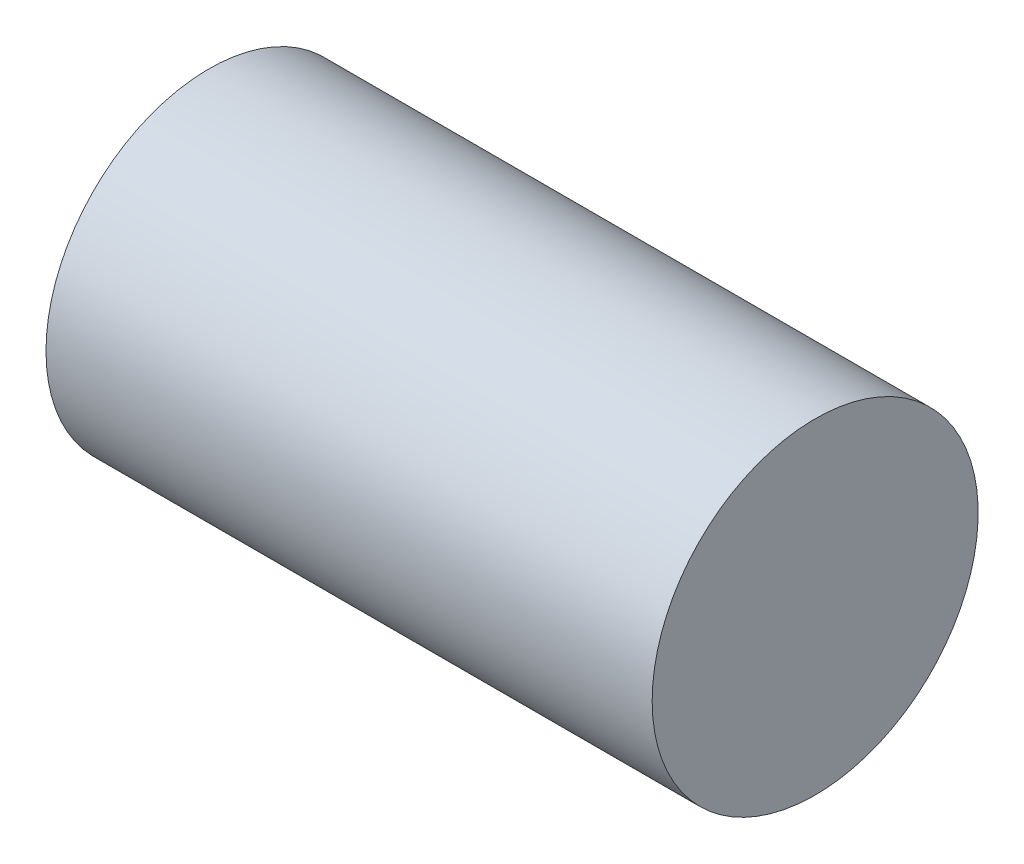
ISO-10303-21;
HEADER;
FILE_DESCRIPTION(('STEP AP214'),'2;1');
FILE_NAME('part.step','',(''),(''),'','','');
FILE_SCHEMA(('AUTOMOTIVE_DESIGN { 1 0 10303 214 1 1 1 1 }'));
ENDSEC;
DATA;
#1=APPLICATION_CONTEXT('core data for automotive mechanical design processes');
#2=APPLICATION_PROTOCOL_DEFINITION('international standard','automotive_design',2000,#1);
#3=PRODUCT_CONTEXT('',#1,'mechanical');
#4=PRODUCT('Part','Part','',(#3));
#5=PRODUCT_RELATED_PRODUCT_CATEGORY('part','',(#4));
#6=PRODUCT_DEFINITION_FORMATION('','',#4);
#7=PRODUCT_DEFINITION_CONTEXT('part definition',#1,'design');
#8=PRODUCT_DEFINITION('design','',#6,#7);
#9=PRODUCT_DEFINITION_SHAPE('','',#8);
#10=(LENGTH_UNIT() NAMED_UNIT(*) SI_UNIT(.MILLI.,.METRE.));
#11=(NAMED_UNIT(*) PLANE_ANGLE_UNIT() SI_UNIT($,.RADIAN.));
#12=(NAMED_UNIT(*) SI_UNIT($,.STERADIAN.) SOLID_ANGLE_UNIT());
#13=UNCERTAINTY_MEASURE_WITH_UNIT(LENGTH_MEASURE(1.E-05),#10,'distance_accuracy_value','');
#14=(GEOMETRIC_REPRESENTATION_CONTEXT(3) GLOBAL_UNCERTAINTY_ASSIGNED_CONTEXT((#13)) GLOBAL_UNIT_ASSIGNED_CONTEXT((#10,
#11,#12)) REPRESENTATION_CONTEXT('',''));
#15=CARTESIAN_POINT('',(0.,0.,0.));
#16=DIRECTION('',(0.,0.,1.));
#17=DIRECTION('',(1.,0.,0.));
#18=AXIS2_PLACEMENT_3D('',#15,#16,#17);
#19=CARTESIAN_POINT('',(-779.039347611489,377.335927831157,-617.65));
#20=DIRECTION('',(-1.,0.,0.));
#21=DIRECTION('',(0.,0.,1.));
#22=AXIS2_PLACEMENT_3D('',#19,#20,#21);
#23=PLANE('',#22);
#24=CARTESIAN_POINT('',(-779.039347611489,328.310927831157,-613.95));
#25=DIRECTION('',(-1.,0.,0.));
#26=DIRECTION('',(0.,0.,1.));
#27=AXIS2_PLACEMENT_3D('',#24,#25,#26);
#28=CIRCLE('',#27,36.449);
#29=CARTESIAN_POINT('',(-779.039347611489,328.310927831157,-577.501));
#30=VERTEX_POINT('',#29);
#31=EDGE_CURVE('E18',#30,#30,#28,.F.);
#32=ORIENTED_EDGE('',*,*,#31,.F.);
#33=EDGE_LOOP('',(#32));
#34=FACE_BOUND('',#33,.T.);
#35=ADVANCED_FACE('F15',(#34),#23,.T.);
#36=CARTESIAN_POINT('',(-643.489347611489,377.335927831157,-617.65));
#37=DIRECTION('',(-1.,0.,0.));
#38=DIRECTION('',(0.,0.,1.));
#39=AXIS2_PLACEMENT_3D('',#36,#37,#38);
#40=PLANE('',#39);
#41=CARTESIAN_POINT('',(-643.489347611489,328.310927831157,-613.95));
#42=DIRECTION('',(-1.,0.,0.));
#43=DIRECTION('',(0.,0.,1.));
#44=AXIS2_PLACEMENT_3D('',#41,#42,#43);
#45=CIRCLE('',#44,36.449);
#46=CARTESIAN_POINT('',(-643.489347611489,328.310927831157,-577.501));
#47=VERTEX_POINT('',#46);
#48=EDGE_CURVE('E10',#47,#47,#45,.T.);
#49=ORIENTED_EDGE('',*,*,#48,.F.);
#50=EDGE_LOOP('',(#49));
#51=FACE_BOUND('',#50,.T.);
#52=ADVANCED_FACE('F30',(#51),#40,.F.);
#53=CARTESIAN_POINT('',(432.060652388511,328.310927831157,-613.95));
#54=DIRECTION('',(-1.,0.,0.));
#55=DIRECTION('',(0.,0.,1.));
#56=AXIS2_PLACEMENT_3D('',#53,#54,#55);
#57=CYLINDRICAL_SURFACE('',#56,36.449);
#58=ORIENTED_EDGE('',*,*,#48,.T.);
#59=EDGE_LOOP('',(#58));
#60=FACE_BOUND('',#59,.T.);
#61=ORIENTED_EDGE('',*,*,#31,.T.);
#62=EDGE_LOOP('',(#61));
#63=FACE_BOUND('',#62,.T.);
#64=ADVANCED_FACE('F27',(#60,#63),#57,.T.);
#65=CLOSED_SHELL('',(#35,#52,#64));
#66=MANIFOLD_SOLID_BREP('B1',#65);
#67=ADVANCED_BREP_SHAPE_REPRESENTATION('',(#18,#66),#14);
#68=SHAPE_DEFINITION_REPRESENTATION(#9,#67);
ENDSEC;
END-ISO-10303-21;
